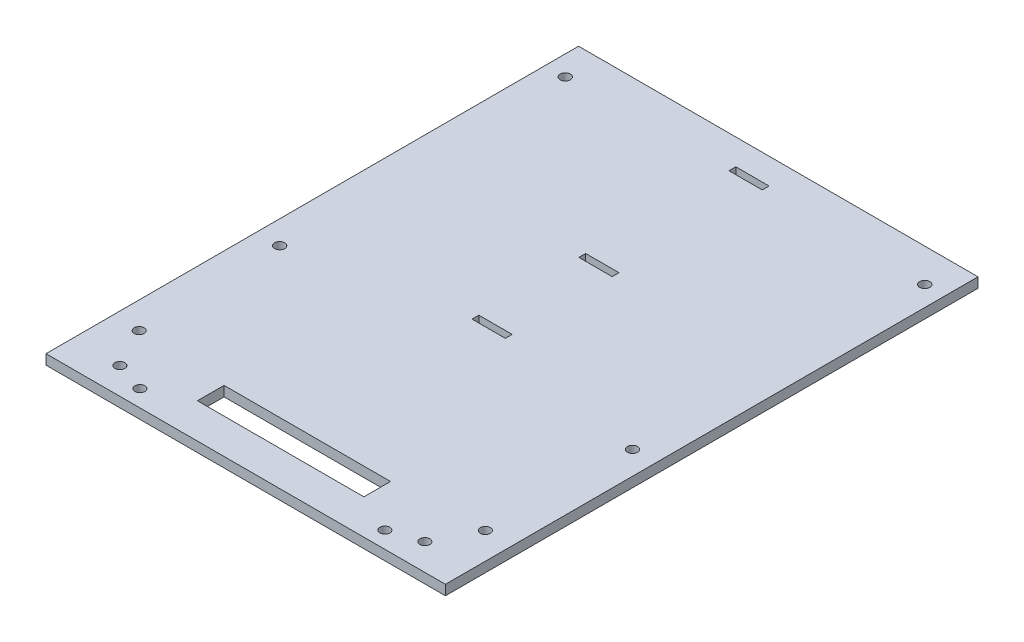
ISO-10303-21;
HEADER;
FILE_DESCRIPTION(('STEP AP214'),'2;1');
FILE_NAME('part.step','',(''),(''),'','','');
FILE_SCHEMA(('AUTOMOTIVE_DESIGN { 1 0 10303 214 1 1 1 1 }'));
ENDSEC;
DATA;
#1=APPLICATION_CONTEXT('core data for automotive mechanical design processes');
#2=APPLICATION_PROTOCOL_DEFINITION('international standard','automotive_design',2000,#1);
#3=PRODUCT_CONTEXT('',#1,'mechanical');
#4=PRODUCT('Part','Part','',(#3));
#5=PRODUCT_RELATED_PRODUCT_CATEGORY('part','',(#4));
#6=PRODUCT_DEFINITION_FORMATION('','',#4);
#7=PRODUCT_DEFINITION_CONTEXT('part definition',#1,'design');
#8=PRODUCT_DEFINITION('design','',#6,#7);
#9=PRODUCT_DEFINITION_SHAPE('','',#8);
#10=(LENGTH_UNIT() NAMED_UNIT(*) SI_UNIT(.MILLI.,.METRE.));
#11=(NAMED_UNIT(*) PLANE_ANGLE_UNIT() SI_UNIT($,.RADIAN.));
#12=(NAMED_UNIT(*) SI_UNIT($,.STERADIAN.) SOLID_ANGLE_UNIT());
#13=UNCERTAINTY_MEASURE_WITH_UNIT(LENGTH_MEASURE(1.E-05),#10,'distance_accuracy_value','');
#14=(GEOMETRIC_REPRESENTATION_CONTEXT(3) GLOBAL_UNCERTAINTY_ASSIGNED_CONTEXT((#13)) GLOBAL_UNIT_ASSIGNED_CONTEXT((#10,
#11,#12)) REPRESENTATION_CONTEXT('',''));
#15=CARTESIAN_POINT('',(0.,0.,0.));
#16=DIRECTION('',(0.,0.,1.));
#17=DIRECTION('',(1.,0.,0.));
#18=AXIS2_PLACEMENT_3D('',#15,#16,#17);
#19=CARTESIAN_POINT('',(-60.,3.,80.));
#20=DIRECTION('',(1.,0.,0.));
#21=DIRECTION('',(0.,0.,-1.));
#22=AXIS2_PLACEMENT_3D('',#19,#20,#21);
#23=PLANE('',#22);
#24=DIRECTION('',(0.,0.,1.));
#25=VECTOR('',#24,1.);
#26=CARTESIAN_POINT('',(-60.,0.,80.));
#27=LINE('',#26,#25);
#28=CARTESIAN_POINT('',(-60.,0.,-80.));
#29=VERTEX_POINT('',#28);
#30=CARTESIAN_POINT('',(-60.,0.,80.));
#31=VERTEX_POINT('',#30);
#32=EDGE_CURVE('E351',#29,#31,#27,.T.);
#33=ORIENTED_EDGE('',*,*,#32,.T.);
#34=DIRECTION('',(0.,-1.,0.));
#35=VECTOR('',#34,1.);
#36=CARTESIAN_POINT('',(-60.,3.,80.));
#37=LINE('',#36,#35);
#38=CARTESIAN_POINT('',(-60.,3.,80.));
#39=VERTEX_POINT('',#38);
#40=EDGE_CURVE('E11',#39,#31,#37,.T.);
#41=ORIENTED_EDGE('',*,*,#40,.F.);
#42=DIRECTION('',(0.,0.,1.));
#43=VECTOR('',#42,1.);
#44=CARTESIAN_POINT('',(-60.,3.,80.));
#45=LINE('',#44,#43);
#46=CARTESIAN_POINT('',(-60.,3.,-80.));
#47=VERTEX_POINT('',#46);
#48=EDGE_CURVE('E354',#47,#39,#45,.T.);
#49=ORIENTED_EDGE('',*,*,#48,.F.);
#50=DIRECTION('',(0.,-1.,0.));
#51=VECTOR('',#50,1.);
#52=CARTESIAN_POINT('',(-60.,3.,-80.));
#53=LINE('',#52,#51);
#54=EDGE_CURVE('E364',#47,#29,#53,.T.);
#55=ORIENTED_EDGE('',*,*,#54,.T.);
#56=EDGE_LOOP('',(#33,#41,#49,#55));
#57=FACE_BOUND('',#56,.T.);
#58=ADVANCED_FACE('F33',(#57),#23,.F.);
#59=CARTESIAN_POINT('',(60.,3.,80.));
#60=DIRECTION('',(0.,0.,-1.));
#61=DIRECTION('',(-1.,0.,0.));
#62=AXIS2_PLACEMENT_3D('',#59,#60,#61);
#63=PLANE('',#62);
#64=DIRECTION('',(1.,0.,0.));
#65=VECTOR('',#64,1.);
#66=CARTESIAN_POINT('',(60.,0.,80.));
#67=LINE('',#66,#65);
#68=CARTESIAN_POINT('',(60.,0.,80.));
#69=VERTEX_POINT('',#68);
#70=EDGE_CURVE('E367',#31,#69,#67,.T.);
#71=ORIENTED_EDGE('',*,*,#70,.T.);
#72=DIRECTION('',(0.,-1.,0.));
#73=VECTOR('',#72,1.);
#74=CARTESIAN_POINT('',(60.,3.,80.));
#75=LINE('',#74,#73);
#76=CARTESIAN_POINT('',(60.,3.,80.));
#77=VERTEX_POINT('',#76);
#78=EDGE_CURVE('E40',#77,#69,#75,.T.);
#79=ORIENTED_EDGE('',*,*,#78,.F.);
#80=DIRECTION('',(1.,0.,0.));
#81=VECTOR('',#80,1.);
#82=CARTESIAN_POINT('',(60.,3.,80.));
#83=LINE('',#82,#81);
#84=EDGE_CURVE('E357',#39,#77,#83,.T.);
#85=ORIENTED_EDGE('',*,*,#84,.F.);
#86=ORIENTED_EDGE('',*,*,#40,.T.);
#87=EDGE_LOOP('',(#71,#79,#85,#86));
#88=FACE_BOUND('',#87,.T.);
#89=ADVANCED_FACE('F396',(#88),#63,.F.);
#90=CARTESIAN_POINT('',(60.,3.,80.));
#91=DIRECTION('',(-1.,0.,0.));
#92=DIRECTION('',(0.,0.,1.));
#93=AXIS2_PLACEMENT_3D('',#90,#91,#92);
#94=PLANE('',#93);
#95=DIRECTION('',(0.,0.,-1.));
#96=VECTOR('',#95,1.);
#97=CARTESIAN_POINT('',(60.,0.,80.));
#98=LINE('',#97,#96);
#99=CARTESIAN_POINT('',(60.,0.,-80.));
#100=VERTEX_POINT('',#99);
#101=EDGE_CURVE('E369',#69,#100,#98,.T.);
#102=ORIENTED_EDGE('',*,*,#101,.T.);
#103=DIRECTION('',(0.,-1.,0.));
#104=VECTOR('',#103,1.);
#105=CARTESIAN_POINT('',(60.,3.,-80.));
#106=LINE('',#105,#104);
#107=CARTESIAN_POINT('',(60.,3.,-80.));
#108=VERTEX_POINT('',#107);
#109=EDGE_CURVE('E374',#108,#100,#106,.T.);
#110=ORIENTED_EDGE('',*,*,#109,.F.);
#111=DIRECTION('',(0.,0.,-1.));
#112=VECTOR('',#111,1.);
#113=CARTESIAN_POINT('',(60.,3.,80.));
#114=LINE('',#113,#112);
#115=EDGE_CURVE('E360',#77,#108,#114,.T.);
#116=ORIENTED_EDGE('',*,*,#115,.F.);
#117=ORIENTED_EDGE('',*,*,#78,.T.);
#118=EDGE_LOOP('',(#102,#110,#116,#117));
#119=FACE_BOUND('',#118,.T.);
#120=ADVANCED_FACE('F381',(#119),#94,.F.);
#121=CARTESIAN_POINT('',(60.,3.,-80.));
#122=DIRECTION('',(0.,0.,1.));
#123=DIRECTION('',(1.,0.,0.));
#124=AXIS2_PLACEMENT_3D('',#121,#122,#123);
#125=PLANE('',#124);
#126=DIRECTION('',(-1.,0.,0.));
#127=VECTOR('',#126,1.);
#128=CARTESIAN_POINT('',(60.,0.,-80.));
#129=LINE('',#128,#127);
#130=EDGE_CURVE('E358',#100,#29,#129,.T.);
#131=ORIENTED_EDGE('',*,*,#130,.T.);
#132=ORIENTED_EDGE('',*,*,#54,.F.);
#133=DIRECTION('',(-1.,0.,0.));
#134=VECTOR('',#133,1.);
#135=CARTESIAN_POINT('',(60.,3.,-80.));
#136=LINE('',#135,#134);
#137=EDGE_CURVE('E362',#108,#47,#136,.T.);
#138=ORIENTED_EDGE('',*,*,#137,.F.);
#139=ORIENTED_EDGE('',*,*,#109,.T.);
#140=EDGE_LOOP('',(#131,#132,#138,#139));
#141=FACE_BOUND('',#140,.T.);
#142=ADVANCED_FACE('F389',(#141),#125,.F.);
#143=CARTESIAN_POINT('',(0.,3.,0.));
#144=DIRECTION('',(0.,1.,0.));
#145=DIRECTION('',(0.,0.,1.));
#146=AXIS2_PLACEMENT_3D('',#143,#144,#145);
#147=PLANE('',#146);
#148=CARTESIAN_POINT('',(36.8,3.,75.));
#149=DIRECTION('',(0.,1.,0.));
#150=DIRECTION('',(0.,0.,-1.));
#151=AXIS2_PLACEMENT_3D('',#148,#149,#150);
#152=CIRCLE('',#151,1.5);
#153=CARTESIAN_POINT('',(36.8,3.,73.5));
#154=VERTEX_POINT('',#153);
#155=EDGE_CURVE('E518',#154,#154,#152,.T.);
#156=ORIENTED_EDGE('',*,*,#155,.F.);
#157=EDGE_LOOP('',(#156));
#158=FACE_BOUND('',#157,.T.);
#159=CARTESIAN_POINT('',(-36.8,3.,75.));
#160=DIRECTION('',(0.,1.,0.));
#161=DIRECTION('',(0.,0.,1.));
#162=AXIS2_PLACEMENT_3D('',#159,#160,#161);
#163=CIRCLE('',#162,1.5);
#164=CARTESIAN_POINT('',(-36.8,3.,76.5));
#165=VERTEX_POINT('',#164);
#166=EDGE_CURVE('E193',#165,#165,#163,.T.);
#167=ORIENTED_EDGE('',*,*,#166,.F.);
#168=EDGE_LOOP('',(#167));
#169=FACE_BOUND('',#168,.T.);
#170=DIRECTION('',(0.,0.,1.));
#171=VECTOR('',#170,1.);
#172=CARTESIAN_POINT('',(-24.9999999999999,3.,69.5));
#173=LINE('',#172,#171);
#174=CARTESIAN_POINT('',(-24.9999999999999,3.,61.5));
#175=VERTEX_POINT('',#174);
#176=CARTESIAN_POINT('',(-24.9999999999999,3.,69.5));
#177=VERTEX_POINT('',#176);
#178=EDGE_CURVE('E47',#175,#177,#173,.T.);
#179=ORIENTED_EDGE('',*,*,#178,.F.);
#180=DIRECTION('',(-1.,0.,0.));
#181=VECTOR('',#180,1.);
#182=CARTESIAN_POINT('',(25.0000000000001,3.,61.5));
#183=LINE('',#182,#181);
#184=CARTESIAN_POINT('',(25.0000000000001,3.,61.5));
#185=VERTEX_POINT('',#184);
#186=EDGE_CURVE('E187',#185,#175,#183,.T.);
#187=ORIENTED_EDGE('',*,*,#186,.F.);
#188=DIRECTION('',(0.,0.,-1.));
#189=VECTOR('',#188,1.);
#190=CARTESIAN_POINT('',(25.0000000000001,3.,69.5));
#191=LINE('',#190,#189);
#192=CARTESIAN_POINT('',(25.0000000000001,3.,69.5));
#193=VERTEX_POINT('',#192);
#194=EDGE_CURVE('E190',#193,#185,#191,.T.);
#195=ORIENTED_EDGE('',*,*,#194,.F.);
#196=DIRECTION('',(1.,0.,0.));
#197=VECTOR('',#196,1.);
#198=CARTESIAN_POINT('',(25.0000000000001,3.,69.5));
#199=LINE('',#198,#197);
#200=EDGE_CURVE('E199',#177,#193,#199,.T.);
#201=ORIENTED_EDGE('',*,*,#200,.F.);
#202=EDGE_LOOP('',(#179,#187,#195,#201));
#203=FACE_BOUND('',#202,.T.);
#204=CARTESIAN_POINT('',(52.,3.,60.));
#205=DIRECTION('',(0.,1.,0.));
#206=DIRECTION('',(0.,0.,-1.));
#207=AXIS2_PLACEMENT_3D('',#204,#205,#206);
#208=CIRCLE('',#207,1.5);
#209=CARTESIAN_POINT('',(52.,3.,58.5));
#210=VERTEX_POINT('',#209);
#211=EDGE_CURVE('E206',#210,#210,#208,.T.);
#212=ORIENTED_EDGE('',*,*,#211,.F.);
#213=EDGE_LOOP('',(#212));
#214=FACE_BOUND('',#213,.T.);
#215=CARTESIAN_POINT('',(45.8153415615735,3.,72.));
#216=DIRECTION('',(0.,1.,0.));
#217=DIRECTION('',(0.,0.,-1.));
#218=AXIS2_PLACEMENT_3D('',#215,#216,#217);
#219=CIRCLE('',#218,1.5);
#220=CARTESIAN_POINT('',(45.8153415615735,3.,70.5));
#221=VERTEX_POINT('',#220);
#222=EDGE_CURVE('E213',#221,#221,#219,.T.);
#223=ORIENTED_EDGE('',*,*,#222,.F.);
#224=EDGE_LOOP('',(#223));
#225=FACE_BOUND('',#224,.T.);
#226=CARTESIAN_POINT('',(-52.,3.,60.));
#227=DIRECTION('',(0.,1.,0.));
#228=DIRECTION('',(0.,0.,1.));
#229=AXIS2_PLACEMENT_3D('',#226,#227,#228);
#230=CIRCLE('',#229,1.5);
#231=CARTESIAN_POINT('',(-52.,3.,61.5));
#232=VERTEX_POINT('',#231);
#233=EDGE_CURVE('E219',#232,#232,#230,.T.);
#234=ORIENTED_EDGE('',*,*,#233,.F.);
#235=EDGE_LOOP('',(#234));
#236=FACE_BOUND('',#235,.T.);
#237=CARTESIAN_POINT('',(-45.8153415615735,3.,72.));
#238=DIRECTION('',(0.,1.,0.));
#239=DIRECTION('',(0.,0.,1.));
#240=AXIS2_PLACEMENT_3D('',#237,#238,#239);
#241=CIRCLE('',#240,1.5);
#242=CARTESIAN_POINT('',(-45.8153415615735,3.,73.5));
#243=VERTEX_POINT('',#242);
#244=EDGE_CURVE('E225',#243,#243,#241,.T.);
#245=ORIENTED_EDGE('',*,*,#244,.F.);
#246=EDGE_LOOP('',(#245));
#247=FACE_BOUND('',#246,.T.);
#248=DIRECTION('',(0.,0.,-1.));
#249=VECTOR('',#248,1.);
#250=CARTESIAN_POINT('',(4.99999999999999,3.,-72.24));
#251=LINE('',#250,#249);
#252=CARTESIAN_POINT('',(4.99999999999999,3.,-70.19));
#253=VERTEX_POINT('',#252);
#254=CARTESIAN_POINT('',(4.99999999999999,3.,-72.24));
#255=VERTEX_POINT('',#254);
#256=EDGE_CURVE('E231',#253,#255,#251,.T.);
#257=ORIENTED_EDGE('',*,*,#256,.F.);
#258=DIRECTION('',(1.,0.,0.));
#259=VECTOR('',#258,1.);
#260=CARTESIAN_POINT('',(-5.00000000000001,3.,-70.19));
#261=LINE('',#260,#259);
#262=CARTESIAN_POINT('',(-5.00000000000001,3.,-70.19));
#263=VERTEX_POINT('',#262);
#264=EDGE_CURVE('E238',#263,#253,#261,.T.);
#265=ORIENTED_EDGE('',*,*,#264,.F.);
#266=DIRECTION('',(0.,0.,1.));
#267=VECTOR('',#266,1.);
#268=CARTESIAN_POINT('',(-5.00000000000001,3.,-72.24));
#269=LINE('',#268,#267);
#270=CARTESIAN_POINT('',(-5.00000000000001,3.,-72.24));
#271=VERTEX_POINT('',#270);
#272=EDGE_CURVE('E252',#271,#263,#269,.T.);
#273=ORIENTED_EDGE('',*,*,#272,.F.);
#274=DIRECTION('',(-1.,0.,0.));
#275=VECTOR('',#274,1.);
#276=CARTESIAN_POINT('',(-5.00000000000001,3.,-72.24));
#277=LINE('',#276,#275);
#278=EDGE_CURVE('E249',#255,#271,#277,.T.);
#279=ORIENTED_EDGE('',*,*,#278,.F.);
#280=EDGE_LOOP('',(#257,#265,#273,#279));
#281=FACE_BOUND('',#280,.T.);
#282=DIRECTION('',(0.,0.,-1.));
#283=VECTOR('',#282,1.);
#284=CARTESIAN_POINT('',(4.99999999999989,3.,-27.14));
#285=LINE('',#284,#283);
#286=CARTESIAN_POINT('',(4.99999999999989,3.,-25.09));
#287=VERTEX_POINT('',#286);
#288=CARTESIAN_POINT('',(4.99999999999989,3.,-27.14));
#289=VERTEX_POINT('',#288);
#290=EDGE_CURVE('E259',#287,#289,#285,.T.);
#291=ORIENTED_EDGE('',*,*,#290,.F.);
#292=DIRECTION('',(1.,0.,0.));
#293=VECTOR('',#292,1.);
#294=CARTESIAN_POINT('',(-5.00000000000011,3.,-25.09));
#295=LINE('',#294,#293);
#296=CARTESIAN_POINT('',(-5.00000000000011,3.,-25.09));
#297=VERTEX_POINT('',#296);
#298=EDGE_CURVE('E270',#297,#287,#295,.T.);
#299=ORIENTED_EDGE('',*,*,#298,.F.);
#300=DIRECTION('',(0.,0.,1.));
#301=VECTOR('',#300,1.);
#302=CARTESIAN_POINT('',(-5.00000000000011,3.,-27.14));
#303=LINE('',#302,#301);
#304=CARTESIAN_POINT('',(-5.00000000000011,3.,-27.14));
#305=VERTEX_POINT('',#304);
#306=EDGE_CURVE('E284',#305,#297,#303,.T.);
#307=ORIENTED_EDGE('',*,*,#306,.F.);
#308=DIRECTION('',(-1.,0.,0.));
#309=VECTOR('',#308,1.);
#310=CARTESIAN_POINT('',(-5.00000000000011,3.,-27.14));
#311=LINE('',#310,#309);
#312=EDGE_CURVE('E281',#289,#305,#311,.T.);
#313=ORIENTED_EDGE('',*,*,#312,.F.);
#314=EDGE_LOOP('',(#291,#299,#307,#313));
#315=FACE_BOUND('',#314,.T.);
#316=DIRECTION('',(0.,0.,-1.));
#317=VECTOR('',#316,1.);
#318=CARTESIAN_POINT('',(5.00000000000001,3.,4.96000000000002));
#319=LINE('',#318,#317);
#320=CARTESIAN_POINT('',(5.00000000000001,3.,7.01000000000002));
#321=VERTEX_POINT('',#320);
#322=CARTESIAN_POINT('',(5.00000000000001,3.,4.96000000000002));
#323=VERTEX_POINT('',#322);
#324=EDGE_CURVE('E291',#321,#323,#319,.T.);
#325=ORIENTED_EDGE('',*,*,#324,.F.);
#326=DIRECTION('',(1.,0.,0.));
#327=VECTOR('',#326,1.);
#328=CARTESIAN_POINT('',(-4.99999999999999,3.,7.01000000000002));
#329=LINE('',#328,#327);
#330=CARTESIAN_POINT('',(-4.99999999999999,3.,7.01000000000002));
#331=VERTEX_POINT('',#330);
#332=EDGE_CURVE('E302',#331,#321,#329,.T.);
#333=ORIENTED_EDGE('',*,*,#332,.F.);
#334=DIRECTION('',(0.,0.,1.));
#335=VECTOR('',#334,1.);
#336=CARTESIAN_POINT('',(-4.99999999999999,3.,4.96000000000002));
#337=LINE('',#336,#335);
#338=CARTESIAN_POINT('',(-4.99999999999999,3.,4.96000000000002));
#339=VERTEX_POINT('',#338);
#340=EDGE_CURVE('E316',#339,#331,#337,.T.);
#341=ORIENTED_EDGE('',*,*,#340,.F.);
#342=DIRECTION('',(-1.,0.,0.));
#343=VECTOR('',#342,1.);
#344=CARTESIAN_POINT('',(-4.99999999999999,3.,4.96000000000002));
#345=LINE('',#344,#343);
#346=EDGE_CURVE('E313',#323,#339,#345,.T.);
#347=ORIENTED_EDGE('',*,*,#346,.F.);
#348=EDGE_LOOP('',(#325,#333,#341,#347));
#349=FACE_BOUND('',#348,.T.);
#350=CARTESIAN_POINT('',(54.,3.,-70.));
#351=DIRECTION('',(0.,1.,0.));
#352=DIRECTION('',(0.,0.,-1.));
#353=AXIS2_PLACEMENT_3D('',#350,#351,#352);
#354=CIRCLE('',#353,1.525);
#355=CARTESIAN_POINT('',(54.,3.,-71.525));
#356=VERTEX_POINT('',#355);
#357=EDGE_CURVE('E323',#356,#356,#354,.T.);
#358=ORIENTED_EDGE('',*,*,#357,.F.);
#359=EDGE_LOOP('',(#358));
#360=FACE_BOUND('',#359,.T.);
#361=CARTESIAN_POINT('',(53.,3.,16.81));
#362=DIRECTION('',(0.,1.,0.));
#363=DIRECTION('',(0.,0.,-1.));
#364=AXIS2_PLACEMENT_3D('',#361,#362,#363);
#365=CIRCLE('',#364,1.525);
#366=CARTESIAN_POINT('',(53.,3.,15.285));
#367=VERTEX_POINT('',#366);
#368=EDGE_CURVE('E333',#367,#367,#365,.T.);
#369=ORIENTED_EDGE('',*,*,#368,.F.);
#370=EDGE_LOOP('',(#369));
#371=FACE_BOUND('',#370,.T.);
#372=CARTESIAN_POINT('',(-53.,3.,16.81));
#373=DIRECTION('',(0.,1.,0.));
#374=DIRECTION('',(0.,0.,1.));
#375=AXIS2_PLACEMENT_3D('',#372,#373,#374);
#376=CIRCLE('',#375,1.525);
#377=CARTESIAN_POINT('',(-53.,3.,18.335));
#378=VERTEX_POINT('',#377);
#379=EDGE_CURVE('E339',#378,#378,#376,.T.);
#380=ORIENTED_EDGE('',*,*,#379,.F.);
#381=EDGE_LOOP('',(#380));
#382=FACE_BOUND('',#381,.T.);
#383=CARTESIAN_POINT('',(-54.,3.,-70.));
#384=DIRECTION('',(0.,1.,0.));
#385=DIRECTION('',(0.,0.,1.));
#386=AXIS2_PLACEMENT_3D('',#383,#384,#385);
#387=CIRCLE('',#386,1.525);
#388=CARTESIAN_POINT('',(-54.,3.,-68.475));
#389=VERTEX_POINT('',#388);
#390=EDGE_CURVE('E345',#389,#389,#387,.T.);
#391=ORIENTED_EDGE('',*,*,#390,.F.);
#392=EDGE_LOOP('',(#391));
#393=FACE_BOUND('',#392,.T.);
#394=ORIENTED_EDGE('',*,*,#48,.T.);
#395=ORIENTED_EDGE('',*,*,#84,.T.);
#396=ORIENTED_EDGE('',*,*,#115,.T.);
#397=ORIENTED_EDGE('',*,*,#137,.T.);
#398=EDGE_LOOP('',(#394,#395,#396,#397));
#399=FACE_BOUND('',#398,.T.);
#400=ADVANCED_FACE('F395',(#158,#169,#203,#214,#225,#236,#247,#281,#315,#349,#360,#371,#382,
#393,#399),#147,.T.);
#401=CARTESIAN_POINT('',(0.,0.,0.));
#402=DIRECTION('',(0.,1.,0.));
#403=DIRECTION('',(0.,0.,1.));
#404=AXIS2_PLACEMENT_3D('',#401,#402,#403);
#405=PLANE('',#404);
#406=CARTESIAN_POINT('',(36.8,0.,75.));
#407=DIRECTION('',(0.,1.,0.));
#408=DIRECTION('',(0.,0.,-1.));
#409=AXIS2_PLACEMENT_3D('',#406,#407,#408);
#410=CIRCLE('',#409,1.5);
#411=CARTESIAN_POINT('',(36.8,0.,73.5));
#412=VERTEX_POINT('',#411);
#413=EDGE_CURVE('E515',#412,#412,#410,.T.);
#414=ORIENTED_EDGE('',*,*,#413,.T.);
#415=EDGE_LOOP('',(#414));
#416=FACE_BOUND('',#415,.T.);
#417=CARTESIAN_POINT('',(-36.8,0.,75.));
#418=DIRECTION('',(0.,1.,0.));
#419=DIRECTION('',(0.,0.,1.));
#420=AXIS2_PLACEMENT_3D('',#417,#418,#419);
#421=CIRCLE('',#420,1.5);
#422=CARTESIAN_POINT('',(-36.8,0.,76.5));
#423=VERTEX_POINT('',#422);
#424=EDGE_CURVE('E200',#423,#423,#421,.T.);
#425=ORIENTED_EDGE('',*,*,#424,.T.);
#426=EDGE_LOOP('',(#425));
#427=FACE_BOUND('',#426,.T.);
#428=DIRECTION('',(-1.,0.,0.));
#429=VECTOR('',#428,1.);
#430=CARTESIAN_POINT('',(25.0000000000001,0.,61.5));
#431=LINE('',#430,#429);
#432=CARTESIAN_POINT('',(25.0000000000001,0.,61.5));
#433=VERTEX_POINT('',#432);
#434=CARTESIAN_POINT('',(-24.9999999999999,0.,61.5));
#435=VERTEX_POINT('',#434);
#436=EDGE_CURVE('E177',#433,#435,#431,.T.);
#437=ORIENTED_EDGE('',*,*,#436,.T.);
#438=DIRECTION('',(0.,0.,1.));
#439=VECTOR('',#438,1.);
#440=CARTESIAN_POINT('',(-24.9999999999999,0.,69.5));
#441=LINE('',#440,#439);
#442=CARTESIAN_POINT('',(-24.9999999999999,0.,69.5));
#443=VERTEX_POINT('',#442);
#444=EDGE_CURVE('E171',#435,#443,#441,.T.);
#445=ORIENTED_EDGE('',*,*,#444,.T.);
#446=DIRECTION('',(1.,0.,0.));
#447=VECTOR('',#446,1.);
#448=CARTESIAN_POINT('',(25.0000000000001,0.,69.5));
#449=LINE('',#448,#447);
#450=CARTESIAN_POINT('',(25.0000000000001,0.,69.5));
#451=VERTEX_POINT('',#450);
#452=EDGE_CURVE('E180',#443,#451,#449,.T.);
#453=ORIENTED_EDGE('',*,*,#452,.T.);
#454=DIRECTION('',(0.,0.,-1.));
#455=VECTOR('',#454,1.);
#456=CARTESIAN_POINT('',(25.0000000000001,0.,69.5));
#457=LINE('',#456,#455);
#458=EDGE_CURVE('E55',#451,#433,#457,.T.);
#459=ORIENTED_EDGE('',*,*,#458,.T.);
#460=EDGE_LOOP('',(#437,#445,#453,#459));
#461=FACE_BOUND('',#460,.T.);
#462=CARTESIAN_POINT('',(52.,0.,60.));
#463=DIRECTION('',(0.,1.,0.));
#464=DIRECTION('',(0.,0.,-1.));
#465=AXIS2_PLACEMENT_3D('',#462,#463,#464);
#466=CIRCLE('',#465,1.5);
#467=CARTESIAN_POINT('',(52.,0.,58.5));
#468=VERTEX_POINT('',#467);
#469=EDGE_CURVE('E210',#468,#468,#466,.T.);
#470=ORIENTED_EDGE('',*,*,#469,.T.);
#471=EDGE_LOOP('',(#470));
#472=FACE_BOUND('',#471,.T.);
#473=CARTESIAN_POINT('',(45.8153415615735,0.,72.));
#474=DIRECTION('',(0.,1.,0.));
#475=DIRECTION('',(0.,0.,-1.));
#476=AXIS2_PLACEMENT_3D('',#473,#474,#475);
#477=CIRCLE('',#476,1.5);
#478=CARTESIAN_POINT('',(45.8153415615735,0.,70.5));
#479=VERTEX_POINT('',#478);
#480=EDGE_CURVE('E216',#479,#479,#477,.T.);
#481=ORIENTED_EDGE('',*,*,#480,.T.);
#482=EDGE_LOOP('',(#481));
#483=FACE_BOUND('',#482,.T.);
#484=CARTESIAN_POINT('',(-52.,0.,60.));
#485=DIRECTION('',(0.,1.,0.));
#486=DIRECTION('',(0.,0.,1.));
#487=AXIS2_PLACEMENT_3D('',#484,#485,#486);
#488=CIRCLE('',#487,1.5);
#489=CARTESIAN_POINT('',(-52.,0.,61.5));
#490=VERTEX_POINT('',#489);
#491=EDGE_CURVE('E222',#490,#490,#488,.T.);
#492=ORIENTED_EDGE('',*,*,#491,.T.);
#493=EDGE_LOOP('',(#492));
#494=FACE_BOUND('',#493,.T.);
#495=CARTESIAN_POINT('',(-45.8153415615735,0.,72.));
#496=DIRECTION('',(0.,1.,0.));
#497=DIRECTION('',(0.,0.,1.));
#498=AXIS2_PLACEMENT_3D('',#495,#496,#497);
#499=CIRCLE('',#498,1.5);
#500=CARTESIAN_POINT('',(-45.8153415615735,0.,73.5));
#501=VERTEX_POINT('',#500);
#502=EDGE_CURVE('E228',#501,#501,#499,.T.);
#503=ORIENTED_EDGE('',*,*,#502,.T.);
#504=EDGE_LOOP('',(#503));
#505=FACE_BOUND('',#504,.T.);
#506=DIRECTION('',(1.,0.,0.));
#507=VECTOR('',#506,1.);
#508=CARTESIAN_POINT('',(-5.00000000000001,0.,-70.19));
#509=LINE('',#508,#507);
#510=CARTESIAN_POINT('',(-5.00000000000001,0.,-70.19));
#511=VERTEX_POINT('',#510);
#512=CARTESIAN_POINT('',(4.99999999999999,0.,-70.19));
#513=VERTEX_POINT('',#512);
#514=EDGE_CURVE('E244',#511,#513,#509,.T.);
#515=ORIENTED_EDGE('',*,*,#514,.T.);
#516=DIRECTION('',(0.,0.,-1.));
#517=VECTOR('',#516,1.);
#518=CARTESIAN_POINT('',(4.99999999999999,0.,-72.24));
#519=LINE('',#518,#517);
#520=CARTESIAN_POINT('',(4.99999999999999,0.,-72.24));
#521=VERTEX_POINT('',#520);
#522=EDGE_CURVE('E234',#513,#521,#519,.T.);
#523=ORIENTED_EDGE('',*,*,#522,.T.);
#524=DIRECTION('',(-1.,0.,0.));
#525=VECTOR('',#524,1.);
#526=CARTESIAN_POINT('',(-5.00000000000001,0.,-72.24));
#527=LINE('',#526,#525);
#528=CARTESIAN_POINT('',(-5.00000000000001,0.,-72.24));
#529=VERTEX_POINT('',#528);
#530=EDGE_CURVE('E237',#521,#529,#527,.T.);
#531=ORIENTED_EDGE('',*,*,#530,.T.);
#532=DIRECTION('',(0.,0.,1.));
#533=VECTOR('',#532,1.);
#534=CARTESIAN_POINT('',(-5.00000000000001,0.,-72.24));
#535=LINE('',#534,#533);
#536=EDGE_CURVE('E241',#529,#511,#535,.T.);
#537=ORIENTED_EDGE('',*,*,#536,.T.);
#538=EDGE_LOOP('',(#515,#523,#531,#537));
#539=FACE_BOUND('',#538,.T.);
#540=DIRECTION('',(1.,0.,0.));
#541=VECTOR('',#540,1.);
#542=CARTESIAN_POINT('',(-5.00000000000011,0.,-25.09));
#543=LINE('',#542,#541);
#544=CARTESIAN_POINT('',(-5.00000000000011,0.,-25.09));
#545=VERTEX_POINT('',#544);
#546=CARTESIAN_POINT('',(4.99999999999989,0.,-25.09));
#547=VERTEX_POINT('',#546);
#548=EDGE_CURVE('E276',#545,#547,#543,.T.);
#549=ORIENTED_EDGE('',*,*,#548,.T.);
#550=DIRECTION('',(0.,0.,-1.));
#551=VECTOR('',#550,1.);
#552=CARTESIAN_POINT('',(4.99999999999989,0.,-27.14));
#553=LINE('',#552,#551);
#554=CARTESIAN_POINT('',(4.99999999999989,0.,-27.14));
#555=VERTEX_POINT('',#554);
#556=EDGE_CURVE('E266',#547,#555,#553,.T.);
#557=ORIENTED_EDGE('',*,*,#556,.T.);
#558=DIRECTION('',(-1.,0.,0.));
#559=VECTOR('',#558,1.);
#560=CARTESIAN_POINT('',(-5.00000000000011,0.,-27.14));
#561=LINE('',#560,#559);
#562=CARTESIAN_POINT('',(-5.00000000000011,0.,-27.14));
#563=VERTEX_POINT('',#562);
#564=EDGE_CURVE('E269',#555,#563,#561,.T.);
#565=ORIENTED_EDGE('',*,*,#564,.T.);
#566=DIRECTION('',(0.,0.,1.));
#567=VECTOR('',#566,1.);
#568=CARTESIAN_POINT('',(-5.00000000000011,0.,-27.14));
#569=LINE('',#568,#567);
#570=EDGE_CURVE('E273',#563,#545,#569,.T.);
#571=ORIENTED_EDGE('',*,*,#570,.T.);
#572=EDGE_LOOP('',(#549,#557,#565,#571));
#573=FACE_BOUND('',#572,.T.);
#574=DIRECTION('',(1.,0.,0.));
#575=VECTOR('',#574,1.);
#576=CARTESIAN_POINT('',(-4.99999999999999,0.,7.01000000000002));
#577=LINE('',#576,#575);
#578=CARTESIAN_POINT('',(-4.99999999999999,0.,7.01000000000002));
#579=VERTEX_POINT('',#578);
#580=CARTESIAN_POINT('',(5.00000000000001,0.,7.01000000000002));
#581=VERTEX_POINT('',#580);
#582=EDGE_CURVE('E308',#579,#581,#577,.T.);
#583=ORIENTED_EDGE('',*,*,#582,.T.);
#584=DIRECTION('',(0.,0.,-1.));
#585=VECTOR('',#584,1.);
#586=CARTESIAN_POINT('',(5.00000000000001,0.,4.96000000000002));
#587=LINE('',#586,#585);
#588=CARTESIAN_POINT('',(5.00000000000001,0.,4.96000000000002));
#589=VERTEX_POINT('',#588);
#590=EDGE_CURVE('E298',#581,#589,#587,.T.);
#591=ORIENTED_EDGE('',*,*,#590,.T.);
#592=DIRECTION('',(-1.,0.,0.));
#593=VECTOR('',#592,1.);
#594=CARTESIAN_POINT('',(-4.99999999999999,0.,4.96000000000002));
#595=LINE('',#594,#593);
#596=CARTESIAN_POINT('',(-4.99999999999999,0.,4.96000000000002));
#597=VERTEX_POINT('',#596);
#598=EDGE_CURVE('E301',#589,#597,#595,.T.);
#599=ORIENTED_EDGE('',*,*,#598,.T.);
#600=DIRECTION('',(0.,0.,1.));
#601=VECTOR('',#600,1.);
#602=CARTESIAN_POINT('',(-4.99999999999999,0.,4.96000000000002));
#603=LINE('',#602,#601);
#604=EDGE_CURVE('E305',#597,#579,#603,.T.);
#605=ORIENTED_EDGE('',*,*,#604,.T.);
#606=EDGE_LOOP('',(#583,#591,#599,#605));
#607=FACE_BOUND('',#606,.T.);
#608=CARTESIAN_POINT('',(54.,0.,-70.));
#609=DIRECTION('',(0.,1.,0.));
#610=DIRECTION('',(0.,0.,-1.));
#611=AXIS2_PLACEMENT_3D('',#608,#609,#610);
#612=CIRCLE('',#611,1.525);
#613=CARTESIAN_POINT('',(54.,0.,-71.525));
#614=VERTEX_POINT('',#613);
#615=EDGE_CURVE('E330',#614,#614,#612,.T.);
#616=ORIENTED_EDGE('',*,*,#615,.T.);
#617=EDGE_LOOP('',(#616));
#618=FACE_BOUND('',#617,.T.);
#619=CARTESIAN_POINT('',(53.,0.,16.81));
#620=DIRECTION('',(0.,1.,0.));
#621=DIRECTION('',(0.,0.,-1.));
#622=AXIS2_PLACEMENT_3D('',#619,#620,#621);
#623=CIRCLE('',#622,1.525);
#624=CARTESIAN_POINT('',(53.,0.,15.285));
#625=VERTEX_POINT('',#624);
#626=EDGE_CURVE('E336',#625,#625,#623,.T.);
#627=ORIENTED_EDGE('',*,*,#626,.T.);
#628=EDGE_LOOP('',(#627));
#629=FACE_BOUND('',#628,.T.);
#630=CARTESIAN_POINT('',(-53.,0.,16.81));
#631=DIRECTION('',(0.,1.,0.));
#632=DIRECTION('',(0.,0.,1.));
#633=AXIS2_PLACEMENT_3D('',#630,#631,#632);
#634=CIRCLE('',#633,1.525);
#635=CARTESIAN_POINT('',(-53.,0.,18.335));
#636=VERTEX_POINT('',#635);
#637=EDGE_CURVE('E342',#636,#636,#634,.T.);
#638=ORIENTED_EDGE('',*,*,#637,.T.);
#639=EDGE_LOOP('',(#638));
#640=FACE_BOUND('',#639,.T.);
#641=CARTESIAN_POINT('',(-54.,0.,-70.));
#642=DIRECTION('',(0.,1.,0.));
#643=DIRECTION('',(0.,0.,1.));
#644=AXIS2_PLACEMENT_3D('',#641,#642,#643);
#645=CIRCLE('',#644,1.525);
#646=CARTESIAN_POINT('',(-54.,0.,-68.475));
#647=VERTEX_POINT('',#646);
#648=EDGE_CURVE('E348',#647,#647,#645,.T.);
#649=ORIENTED_EDGE('',*,*,#648,.T.);
#650=EDGE_LOOP('',(#649));
#651=FACE_BOUND('',#650,.T.);
#652=ORIENTED_EDGE('',*,*,#32,.F.);
#653=ORIENTED_EDGE('',*,*,#130,.F.);
#654=ORIENTED_EDGE('',*,*,#101,.F.);
#655=ORIENTED_EDGE('',*,*,#70,.F.);
#656=EDGE_LOOP('',(#652,#653,#654,#655));
#657=FACE_BOUND('',#656,.T.);
#658=ADVANCED_FACE('F184',(#416,#427,#461,#472,#483,#494,#505,#539,#573,#607,#618,#629,#640,
#651,#657),#405,.F.);
#659=CARTESIAN_POINT('',(-54.,0.,-70.));
#660=DIRECTION('',(0.,1.,0.));
#661=DIRECTION('',(0.,0.,1.));
#662=AXIS2_PLACEMENT_3D('',#659,#660,#661);
#663=CYLINDRICAL_SURFACE('',#662,1.525);
#664=ORIENTED_EDGE('',*,*,#648,.F.);
#665=EDGE_LOOP('',(#664));
#666=FACE_BOUND('',#665,.T.);
#667=ORIENTED_EDGE('',*,*,#390,.T.);
#668=EDGE_LOOP('',(#667));
#669=FACE_BOUND('',#668,.T.);
#670=ADVANCED_FACE('F408',(#666,#669),#663,.F.);
#671=CARTESIAN_POINT('',(-53.,0.,16.81));
#672=DIRECTION('',(0.,1.,0.));
#673=DIRECTION('',(0.,0.,1.));
#674=AXIS2_PLACEMENT_3D('',#671,#672,#673);
#675=CYLINDRICAL_SURFACE('',#674,1.525);
#676=ORIENTED_EDGE('',*,*,#637,.F.);
#677=EDGE_LOOP('',(#676));
#678=FACE_BOUND('',#677,.T.);
#679=ORIENTED_EDGE('',*,*,#379,.T.);
#680=EDGE_LOOP('',(#679));
#681=FACE_BOUND('',#680,.T.);
#682=ADVANCED_FACE('F415',(#678,#681),#675,.F.);
#683=CARTESIAN_POINT('',(53.,0.,16.81));
#684=DIRECTION('',(0.,1.,0.));
#685=DIRECTION('',(0.,0.,1.));
#686=AXIS2_PLACEMENT_3D('',#683,#684,#685);
#687=CYLINDRICAL_SURFACE('',#686,1.525);
#688=ORIENTED_EDGE('',*,*,#626,.F.);
#689=EDGE_LOOP('',(#688));
#690=FACE_BOUND('',#689,.T.);
#691=ORIENTED_EDGE('',*,*,#368,.T.);
#692=EDGE_LOOP('',(#691));
#693=FACE_BOUND('',#692,.T.);
#694=ADVANCED_FACE('F419',(#690,#693),#687,.F.);
#695=CARTESIAN_POINT('',(54.,0.,-70.));
#696=DIRECTION('',(0.,1.,0.));
#697=DIRECTION('',(0.,0.,1.));
#698=AXIS2_PLACEMENT_3D('',#695,#696,#697);
#699=CYLINDRICAL_SURFACE('',#698,1.525);
#700=ORIENTED_EDGE('',*,*,#615,.F.);
#701=EDGE_LOOP('',(#700));
#702=FACE_BOUND('',#701,.T.);
#703=ORIENTED_EDGE('',*,*,#357,.T.);
#704=EDGE_LOOP('',(#703));
#705=FACE_BOUND('',#704,.T.);
#706=ADVANCED_FACE('F423',(#702,#705),#699,.F.);
#707=CARTESIAN_POINT('',(5.00000000000001,0.,4.96000000000002));
#708=DIRECTION('',(1.,0.,0.));
#709=DIRECTION('',(0.,0.,-1.));
#710=AXIS2_PLACEMENT_3D('',#707,#708,#709);
#711=PLANE('',#710);
#712=ORIENTED_EDGE('',*,*,#324,.T.);
#713=DIRECTION('',(0.,1.,0.));
#714=VECTOR('',#713,1.);
#715=CARTESIAN_POINT('',(5.00000000000001,0.,4.96000000000002));
#716=LINE('',#715,#714);
#717=EDGE_CURVE('E311',#589,#323,#716,.T.);
#718=ORIENTED_EDGE('',*,*,#717,.F.);
#719=ORIENTED_EDGE('',*,*,#590,.F.);
#720=DIRECTION('',(0.,1.,0.));
#721=VECTOR('',#720,1.);
#722=CARTESIAN_POINT('',(5.00000000000001,0.,7.01000000000002));
#723=LINE('',#722,#721);
#724=EDGE_CURVE('E321',#581,#321,#723,.T.);
#725=ORIENTED_EDGE('',*,*,#724,.T.);
#726=EDGE_LOOP('',(#712,#718,#719,#725));
#727=FACE_BOUND('',#726,.T.);
#728=ADVANCED_FACE('F427',(#727),#711,.F.);
#729=CARTESIAN_POINT('',(-4.99999999999999,0.,7.01000000000002));
#730=DIRECTION('',(0.,0.,1.));
#731=DIRECTION('',(1.,0.,0.));
#732=AXIS2_PLACEMENT_3D('',#729,#730,#731);
#733=PLANE('',#732);
#734=ORIENTED_EDGE('',*,*,#332,.T.);
#735=ORIENTED_EDGE('',*,*,#724,.F.);
#736=ORIENTED_EDGE('',*,*,#582,.F.);
#737=DIRECTION('',(0.,1.,0.));
#738=VECTOR('',#737,1.);
#739=CARTESIAN_POINT('',(-4.99999999999999,0.,7.01000000000002));
#740=LINE('',#739,#738);
#741=EDGE_CURVE('E324',#579,#331,#740,.T.);
#742=ORIENTED_EDGE('',*,*,#741,.T.);
#743=EDGE_LOOP('',(#734,#735,#736,#742));
#744=FACE_BOUND('',#743,.T.);
#745=ADVANCED_FACE('F431',(#744),#733,.F.);
#746=CARTESIAN_POINT('',(-4.99999999999999,0.,4.96000000000002));
#747=DIRECTION('',(-1.,0.,0.));
#748=DIRECTION('',(0.,0.,1.));
#749=AXIS2_PLACEMENT_3D('',#746,#747,#748);
#750=PLANE('',#749);
#751=ORIENTED_EDGE('',*,*,#340,.T.);
#752=ORIENTED_EDGE('',*,*,#741,.F.);
#753=ORIENTED_EDGE('',*,*,#604,.F.);
#754=DIRECTION('',(0.,1.,0.));
#755=VECTOR('',#754,1.);
#756=CARTESIAN_POINT('',(-4.99999999999999,0.,4.96000000000002));
#757=LINE('',#756,#755);
#758=EDGE_CURVE('E326',#597,#339,#757,.T.);
#759=ORIENTED_EDGE('',*,*,#758,.T.);
#760=EDGE_LOOP('',(#751,#752,#753,#759));
#761=FACE_BOUND('',#760,.T.);
#762=ADVANCED_FACE('F437',(#761),#750,.F.);
#763=CARTESIAN_POINT('',(-4.99999999999999,0.,4.96000000000002));
#764=DIRECTION('',(0.,0.,-1.));
#765=DIRECTION('',(-1.,0.,0.));
#766=AXIS2_PLACEMENT_3D('',#763,#764,#765);
#767=PLANE('',#766);
#768=ORIENTED_EDGE('',*,*,#346,.T.);
#769=ORIENTED_EDGE('',*,*,#758,.F.);
#770=ORIENTED_EDGE('',*,*,#598,.F.);
#771=ORIENTED_EDGE('',*,*,#717,.T.);
#772=EDGE_LOOP('',(#768,#769,#770,#771));
#773=FACE_BOUND('',#772,.T.);
#774=ADVANCED_FACE('F433',(#773),#767,.F.);
#775=CARTESIAN_POINT('',(4.99999999999989,0.,-27.14));
#776=DIRECTION('',(1.,0.,0.));
#777=DIRECTION('',(0.,0.,-1.));
#778=AXIS2_PLACEMENT_3D('',#775,#776,#777);
#779=PLANE('',#778);
#780=ORIENTED_EDGE('',*,*,#290,.T.);
#781=DIRECTION('',(0.,1.,0.));
#782=VECTOR('',#781,1.);
#783=CARTESIAN_POINT('',(4.99999999999989,0.,-27.14));
#784=LINE('',#783,#782);
#785=EDGE_CURVE('E279',#555,#289,#784,.T.);
#786=ORIENTED_EDGE('',*,*,#785,.F.);
#787=ORIENTED_EDGE('',*,*,#556,.F.);
#788=DIRECTION('',(0.,1.,0.));
#789=VECTOR('',#788,1.);
#790=CARTESIAN_POINT('',(4.99999999999989,0.,-25.09));
#791=LINE('',#790,#789);
#792=EDGE_CURVE('E289',#547,#287,#791,.T.);
#793=ORIENTED_EDGE('',*,*,#792,.T.);
#794=EDGE_LOOP('',(#780,#786,#787,#793));
#795=FACE_BOUND('',#794,.T.);
#796=ADVANCED_FACE('F436',(#795),#779,.F.);
#797=CARTESIAN_POINT('',(-5.00000000000011,0.,-25.09));
#798=DIRECTION('',(0.,0.,1.));
#799=DIRECTION('',(1.,0.,0.));
#800=AXIS2_PLACEMENT_3D('',#797,#798,#799);
#801=PLANE('',#800);
#802=ORIENTED_EDGE('',*,*,#298,.T.);
#803=ORIENTED_EDGE('',*,*,#792,.F.);
#804=ORIENTED_EDGE('',*,*,#548,.F.);
#805=DIRECTION('',(0.,1.,0.));
#806=VECTOR('',#805,1.);
#807=CARTESIAN_POINT('',(-5.00000000000011,0.,-25.09));
#808=LINE('',#807,#806);
#809=EDGE_CURVE('E292',#545,#297,#808,.T.);
#810=ORIENTED_EDGE('',*,*,#809,.T.);
#811=EDGE_LOOP('',(#802,#803,#804,#810));
#812=FACE_BOUND('',#811,.T.);
#813=ADVANCED_FACE('F447',(#812),#801,.F.);
#814=CARTESIAN_POINT('',(-5.00000000000011,0.,-27.14));
#815=DIRECTION('',(-1.,0.,0.));
#816=DIRECTION('',(0.,0.,1.));
#817=AXIS2_PLACEMENT_3D('',#814,#815,#816);
#818=PLANE('',#817);
#819=ORIENTED_EDGE('',*,*,#306,.T.);
#820=ORIENTED_EDGE('',*,*,#809,.F.);
#821=ORIENTED_EDGE('',*,*,#570,.F.);
#822=DIRECTION('',(0.,1.,0.));
#823=VECTOR('',#822,1.);
#824=CARTESIAN_POINT('',(-5.00000000000011,0.,-27.14));
#825=LINE('',#824,#823);
#826=EDGE_CURVE('E294',#563,#305,#825,.T.);
#827=ORIENTED_EDGE('',*,*,#826,.T.);
#828=EDGE_LOOP('',(#819,#820,#821,#827));
#829=FACE_BOUND('',#828,.T.);
#830=ADVANCED_FACE('F453',(#829),#818,.F.);
#831=CARTESIAN_POINT('',(-5.00000000000011,0.,-27.14));
#832=DIRECTION('',(0.,0.,-1.));
#833=DIRECTION('',(-1.,0.,0.));
#834=AXIS2_PLACEMENT_3D('',#831,#832,#833);
#835=PLANE('',#834);
#836=ORIENTED_EDGE('',*,*,#312,.T.);
#837=ORIENTED_EDGE('',*,*,#826,.F.);
#838=ORIENTED_EDGE('',*,*,#564,.F.);
#839=ORIENTED_EDGE('',*,*,#785,.T.);
#840=EDGE_LOOP('',(#836,#837,#838,#839));
#841=FACE_BOUND('',#840,.T.);
#842=ADVANCED_FACE('F449',(#841),#835,.F.);
#843=CARTESIAN_POINT('',(4.99999999999999,0.,-72.24));
#844=DIRECTION('',(1.,0.,0.));
#845=DIRECTION('',(0.,0.,-1.));
#846=AXIS2_PLACEMENT_3D('',#843,#844,#845);
#847=PLANE('',#846);
#848=ORIENTED_EDGE('',*,*,#256,.T.);
#849=DIRECTION('',(0.,1.,0.));
#850=VECTOR('',#849,1.);
#851=CARTESIAN_POINT('',(4.99999999999999,0.,-72.24));
#852=LINE('',#851,#850);
#853=EDGE_CURVE('E247',#521,#255,#852,.T.);
#854=ORIENTED_EDGE('',*,*,#853,.F.);
#855=ORIENTED_EDGE('',*,*,#522,.F.);
#856=DIRECTION('',(0.,1.,0.));
#857=VECTOR('',#856,1.);
#858=CARTESIAN_POINT('',(4.99999999999999,0.,-70.19));
#859=LINE('',#858,#857);
#860=EDGE_CURVE('E257',#513,#253,#859,.T.);
#861=ORIENTED_EDGE('',*,*,#860,.T.);
#862=EDGE_LOOP('',(#848,#854,#855,#861));
#863=FACE_BOUND('',#862,.T.);
#864=ADVANCED_FACE('F452',(#863),#847,.F.);
#865=CARTESIAN_POINT('',(-5.00000000000001,0.,-70.19));
#866=DIRECTION('',(0.,0.,1.));
#867=DIRECTION('',(1.,0.,0.));
#868=AXIS2_PLACEMENT_3D('',#865,#866,#867);
#869=PLANE('',#868);
#870=ORIENTED_EDGE('',*,*,#264,.T.);
#871=ORIENTED_EDGE('',*,*,#860,.F.);
#872=ORIENTED_EDGE('',*,*,#514,.F.);
#873=DIRECTION('',(0.,1.,0.));
#874=VECTOR('',#873,1.);
#875=CARTESIAN_POINT('',(-5.00000000000001,0.,-70.19));
#876=LINE('',#875,#874);
#877=EDGE_CURVE('E260',#511,#263,#876,.T.);
#878=ORIENTED_EDGE('',*,*,#877,.T.);
#879=EDGE_LOOP('',(#870,#871,#872,#878));
#880=FACE_BOUND('',#879,.T.);
#881=ADVANCED_FACE('F463',(#880),#869,.F.);
#882=CARTESIAN_POINT('',(-5.00000000000001,0.,-72.24));
#883=DIRECTION('',(-1.,0.,0.));
#884=DIRECTION('',(0.,0.,1.));
#885=AXIS2_PLACEMENT_3D('',#882,#883,#884);
#886=PLANE('',#885);
#887=ORIENTED_EDGE('',*,*,#272,.T.);
#888=ORIENTED_EDGE('',*,*,#877,.F.);
#889=ORIENTED_EDGE('',*,*,#536,.F.);
#890=DIRECTION('',(0.,1.,0.));
#891=VECTOR('',#890,1.);
#892=CARTESIAN_POINT('',(-5.00000000000001,0.,-72.24));
#893=LINE('',#892,#891);
#894=EDGE_CURVE('E262',#529,#271,#893,.T.);
#895=ORIENTED_EDGE('',*,*,#894,.T.);
#896=EDGE_LOOP('',(#887,#888,#889,#895));
#897=FACE_BOUND('',#896,.T.);
#898=ADVANCED_FACE('F469',(#897),#886,.F.);
#899=CARTESIAN_POINT('',(-5.00000000000001,0.,-72.24));
#900=DIRECTION('',(0.,0.,-1.));
#901=DIRECTION('',(-1.,0.,0.));
#902=AXIS2_PLACEMENT_3D('',#899,#900,#901);
#903=PLANE('',#902);
#904=ORIENTED_EDGE('',*,*,#278,.T.);
#905=ORIENTED_EDGE('',*,*,#894,.F.);
#906=ORIENTED_EDGE('',*,*,#530,.F.);
#907=ORIENTED_EDGE('',*,*,#853,.T.);
#908=EDGE_LOOP('',(#904,#905,#906,#907));
#909=FACE_BOUND('',#908,.T.);
#910=ADVANCED_FACE('F465',(#909),#903,.F.);
#911=CARTESIAN_POINT('',(-45.8153415615735,0.,72.));
#912=DIRECTION('',(0.,1.,0.));
#913=DIRECTION('',(0.,0.,1.));
#914=AXIS2_PLACEMENT_3D('',#911,#912,#913);
#915=CYLINDRICAL_SURFACE('',#914,1.5);
#916=ORIENTED_EDGE('',*,*,#502,.F.);
#917=EDGE_LOOP('',(#916));
#918=FACE_BOUND('',#917,.T.);
#919=ORIENTED_EDGE('',*,*,#244,.T.);
#920=EDGE_LOOP('',(#919));
#921=FACE_BOUND('',#920,.T.);
#922=ADVANCED_FACE('F468',(#918,#921),#915,.F.);
#923=CARTESIAN_POINT('',(-52.,0.,60.));
#924=DIRECTION('',(0.,1.,0.));
#925=DIRECTION('',(0.,0.,1.));
#926=AXIS2_PLACEMENT_3D('',#923,#924,#925);
#927=CYLINDRICAL_SURFACE('',#926,1.5);
#928=ORIENTED_EDGE('',*,*,#491,.F.);
#929=EDGE_LOOP('',(#928));
#930=FACE_BOUND('',#929,.T.);
#931=ORIENTED_EDGE('',*,*,#233,.T.);
#932=EDGE_LOOP('',(#931));
#933=FACE_BOUND('',#932,.T.);
#934=ADVANCED_FACE('F479',(#930,#933),#927,.F.);
#935=CARTESIAN_POINT('',(45.8153415615735,0.,72.));
#936=DIRECTION('',(0.,1.,0.));
#937=DIRECTION('',(0.,0.,1.));
#938=AXIS2_PLACEMENT_3D('',#935,#936,#937);
#939=CYLINDRICAL_SURFACE('',#938,1.5);
#940=ORIENTED_EDGE('',*,*,#480,.F.);
#941=EDGE_LOOP('',(#940));
#942=FACE_BOUND('',#941,.T.);
#943=ORIENTED_EDGE('',*,*,#222,.T.);
#944=EDGE_LOOP('',(#943));
#945=FACE_BOUND('',#944,.T.);
#946=ADVANCED_FACE('F483',(#942,#945),#939,.F.);
#947=CARTESIAN_POINT('',(52.,0.,60.));
#948=DIRECTION('',(0.,1.,0.));
#949=DIRECTION('',(0.,0.,1.));
#950=AXIS2_PLACEMENT_3D('',#947,#948,#949);
#951=CYLINDRICAL_SURFACE('',#950,1.5);
#952=ORIENTED_EDGE('',*,*,#469,.F.);
#953=EDGE_LOOP('',(#952));
#954=FACE_BOUND('',#953,.T.);
#955=ORIENTED_EDGE('',*,*,#211,.T.);
#956=EDGE_LOOP('',(#955));
#957=FACE_BOUND('',#956,.T.);
#958=ADVANCED_FACE('F487',(#954,#957),#951,.F.);
#959=CARTESIAN_POINT('',(-24.9999999999999,0.,69.5));
#960=DIRECTION('',(-1.,0.,0.));
#961=DIRECTION('',(0.,0.,1.));
#962=AXIS2_PLACEMENT_3D('',#959,#960,#961);
#963=PLANE('',#962);
#964=ORIENTED_EDGE('',*,*,#178,.T.);
#965=DIRECTION('',(0.,1.,0.));
#966=VECTOR('',#965,1.);
#967=CARTESIAN_POINT('',(-24.9999999999999,0.,69.5));
#968=LINE('',#967,#966);
#969=EDGE_CURVE('E167',#443,#177,#968,.T.);
#970=ORIENTED_EDGE('',*,*,#969,.F.);
#971=ORIENTED_EDGE('',*,*,#444,.F.);
#972=DIRECTION('',(0.,1.,0.));
#973=VECTOR('',#972,1.);
#974=CARTESIAN_POINT('',(-24.9999999999999,0.,61.5));
#975=LINE('',#974,#973);
#976=EDGE_CURVE('E204',#435,#175,#975,.T.);
#977=ORIENTED_EDGE('',*,*,#976,.T.);
#978=EDGE_LOOP('',(#964,#970,#971,#977));
#979=FACE_BOUND('',#978,.T.);
#980=ADVANCED_FACE('F169',(#979),#963,.F.);
#981=CARTESIAN_POINT('',(25.0000000000001,0.,61.5));
#982=DIRECTION('',(0.,0.,-1.));
#983=DIRECTION('',(-1.,0.,0.));
#984=AXIS2_PLACEMENT_3D('',#981,#982,#983);
#985=PLANE('',#984);
#986=ORIENTED_EDGE('',*,*,#186,.T.);
#987=ORIENTED_EDGE('',*,*,#976,.F.);
#988=ORIENTED_EDGE('',*,*,#436,.F.);
#989=DIRECTION('',(0.,1.,0.));
#990=VECTOR('',#989,1.);
#991=CARTESIAN_POINT('',(25.0000000000001,0.,61.5));
#992=LINE('',#991,#990);
#993=EDGE_CURVE('E207',#433,#185,#992,.T.);
#994=ORIENTED_EDGE('',*,*,#993,.T.);
#995=EDGE_LOOP('',(#986,#987,#988,#994));
#996=FACE_BOUND('',#995,.T.);
#997=ADVANCED_FACE('F494',(#996),#985,.F.);
#998=CARTESIAN_POINT('',(25.0000000000001,0.,69.5));
#999=DIRECTION('',(1.,0.,0.));
#1000=DIRECTION('',(0.,0.,-1.));
#1001=AXIS2_PLACEMENT_3D('',#998,#999,#1000);
#1002=PLANE('',#1001);
#1003=ORIENTED_EDGE('',*,*,#194,.T.);
#1004=ORIENTED_EDGE('',*,*,#993,.F.);
#1005=ORIENTED_EDGE('',*,*,#458,.F.);
#1006=DIRECTION('',(0.,1.,0.));
#1007=VECTOR('',#1006,1.);
#1008=CARTESIAN_POINT('',(25.0000000000001,0.,69.5));
#1009=LINE('',#1008,#1007);
#1010=EDGE_CURVE('E176',#451,#193,#1009,.T.);
#1011=ORIENTED_EDGE('',*,*,#1010,.T.);
#1012=EDGE_LOOP('',(#1003,#1004,#1005,#1011));
#1013=FACE_BOUND('',#1012,.T.);
#1014=ADVANCED_FACE('F498',(#1013),#1002,.F.);
#1015=CARTESIAN_POINT('',(25.0000000000001,0.,69.5));
#1016=DIRECTION('',(0.,0.,1.));
#1017=DIRECTION('',(1.,0.,0.));
#1018=AXIS2_PLACEMENT_3D('',#1015,#1016,#1017);
#1019=PLANE('',#1018);
#1020=ORIENTED_EDGE('',*,*,#200,.T.);
#1021=ORIENTED_EDGE('',*,*,#1010,.F.);
#1022=ORIENTED_EDGE('',*,*,#452,.F.);
#1023=ORIENTED_EDGE('',*,*,#969,.T.);
#1024=EDGE_LOOP('',(#1020,#1021,#1022,#1023));
#1025=FACE_BOUND('',#1024,.T.);
#1026=ADVANCED_FACE('F181',(#1025),#1019,.F.);
#1027=CARTESIAN_POINT('',(-36.8,0.,75.));
#1028=DIRECTION('',(0.,1.,0.));
#1029=DIRECTION('',(0.,0.,1.));
#1030=AXIS2_PLACEMENT_3D('',#1027,#1028,#1029);
#1031=CYLINDRICAL_SURFACE('',#1030,1.5);
#1032=ORIENTED_EDGE('',*,*,#424,.F.);
#1033=EDGE_LOOP('',(#1032));
#1034=FACE_BOUND('',#1033,.T.);
#1035=ORIENTED_EDGE('',*,*,#166,.T.);
#1036=EDGE_LOOP('',(#1035));
#1037=FACE_BOUND('',#1036,.T.);
#1038=ADVANCED_FACE('F497',(#1034,#1037),#1031,.F.);
#1039=CARTESIAN_POINT('',(36.8,0.,75.));
#1040=DIRECTION('',(0.,1.,0.));
#1041=DIRECTION('',(0.,0.,1.));
#1042=AXIS2_PLACEMENT_3D('',#1039,#1040,#1041);
#1043=CYLINDRICAL_SURFACE('',#1042,1.5);
#1044=ORIENTED_EDGE('',*,*,#413,.F.);
#1045=EDGE_LOOP('',(#1044));
#1046=FACE_BOUND('',#1045,.T.);
#1047=ORIENTED_EDGE('',*,*,#155,.T.);
#1048=EDGE_LOOP('',(#1047));
#1049=FACE_BOUND('',#1048,.T.);
#1050=ADVANCED_FACE('F506',(#1046,#1049),#1043,.F.);
#1051=CLOSED_SHELL('',(#58,#89,#120,#142,#400,#658,#670,#682,#694,#706,#728,#745,#762,#774,#796,
#813,#830,#842,#864,#881,#898,#910,#922,#934,#946,#958,#980,#997,#1014,#1026,#1038,#1050));
#1052=MANIFOLD_SOLID_BREP('B2',#1051);
#1053=ADVANCED_BREP_SHAPE_REPRESENTATION('',(#18,#1052),#14);
#1054=SHAPE_DEFINITION_REPRESENTATION(#9,#1053);
ENDSEC;
END-ISO-10303-21;
